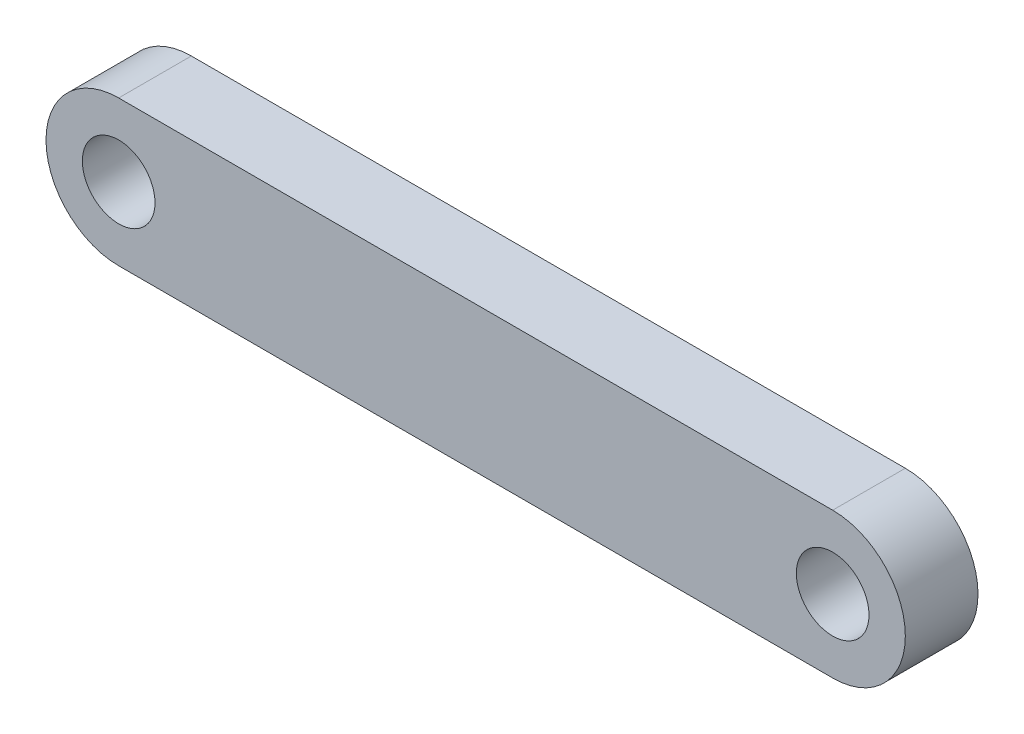
ISO-10303-21;
HEADER;
FILE_DESCRIPTION(('STEP AP214'),'2;1');
FILE_NAME('part.step','',(''),(''),'','','');
FILE_SCHEMA(('AUTOMOTIVE_DESIGN { 1 0 10303 214 1 1 1 1 }'));
ENDSEC;
DATA;
#1=APPLICATION_CONTEXT('core data for automotive mechanical design processes');
#2=APPLICATION_PROTOCOL_DEFINITION('international standard','automotive_design',2000,#1);
#3=PRODUCT_CONTEXT('',#1,'mechanical');
#4=PRODUCT('Part','Part','',(#3));
#5=PRODUCT_RELATED_PRODUCT_CATEGORY('part','',(#4));
#6=PRODUCT_DEFINITION_FORMATION('','',#4);
#7=PRODUCT_DEFINITION_CONTEXT('part definition',#1,'design');
#8=PRODUCT_DEFINITION('design','',#6,#7);
#9=PRODUCT_DEFINITION_SHAPE('','',#8);
#10=(LENGTH_UNIT() NAMED_UNIT(*) SI_UNIT(.MILLI.,.METRE.));
#11=(NAMED_UNIT(*) PLANE_ANGLE_UNIT() SI_UNIT($,.RADIAN.));
#12=(NAMED_UNIT(*) SI_UNIT($,.STERADIAN.) SOLID_ANGLE_UNIT());
#13=UNCERTAINTY_MEASURE_WITH_UNIT(LENGTH_MEASURE(1.E-05),#10,'distance_accuracy_value','');
#14=(GEOMETRIC_REPRESENTATION_CONTEXT(3) GLOBAL_UNCERTAINTY_ASSIGNED_CONTEXT((#13)) GLOBAL_UNIT_ASSIGNED_CONTEXT((#10,
#11,#12)) REPRESENTATION_CONTEXT('',''));
#15=CARTESIAN_POINT('',(0.,0.,0.));
#16=DIRECTION('',(0.,0.,1.));
#17=DIRECTION('',(1.,0.,0.));
#18=AXIS2_PLACEMENT_3D('',#15,#16,#17);
#19=CARTESIAN_POINT('',(0.,0.,2.));
#20=DIRECTION('',(0.,0.,1.));
#21=DIRECTION('',(1.,0.,0.));
#22=AXIS2_PLACEMENT_3D('',#19,#20,#21);
#23=PLANE('',#22);
#24=CARTESIAN_POINT('',(0.,0.,2.));
#25=DIRECTION('',(0.,0.,1.));
#26=DIRECTION('',(1.,0.,0.));
#27=AXIS2_PLACEMENT_3D('',#24,#25,#26);
#28=CIRCLE('',#27,1.);
#29=CARTESIAN_POINT('',(1.,0.,2.));
#30=VERTEX_POINT('',#29);
#31=EDGE_CURVE('E112',#30,#30,#28,.T.);
#32=ORIENTED_EDGE('',*,*,#31,.F.);
#33=EDGE_LOOP('',(#32));
#34=FACE_BOUND('',#33,.T.);
#35=CARTESIAN_POINT('',(0.,0.,2.));
#36=DIRECTION('',(0.,0.,1.));
#37=DIRECTION('',(1.,0.,0.));
#38=AXIS2_PLACEMENT_3D('',#35,#36,#37);
#39=CIRCLE('',#38,2.);
#40=CARTESIAN_POINT('',(0.,2.,2.));
#41=VERTEX_POINT('',#40);
#42=CARTESIAN_POINT('',(0.,-2.,2.));
#43=VERTEX_POINT('',#42);
#44=EDGE_CURVE('E92',#41,#43,#39,.T.);
#45=ORIENTED_EDGE('',*,*,#44,.T.);
#46=DIRECTION('',(1.,0.,0.));
#47=VECTOR('',#46,1.);
#48=CARTESIAN_POINT('',(0.,-2.,2.));
#49=LINE('',#48,#47);
#50=CARTESIAN_POINT('',(19.65,-2.,2.));
#51=VERTEX_POINT('',#50);
#52=EDGE_CURVE('E87',#43,#51,#49,.T.);
#53=ORIENTED_EDGE('',*,*,#52,.T.);
#54=CARTESIAN_POINT('',(19.65,0.,2.));
#55=DIRECTION('',(0.,0.,1.));
#56=DIRECTION('',(1.,0.,0.));
#57=AXIS2_PLACEMENT_3D('',#54,#55,#56);
#58=CIRCLE('',#57,2.);
#59=CARTESIAN_POINT('',(19.65,2.,2.));
#60=VERTEX_POINT('',#59);
#61=EDGE_CURVE('E90',#51,#60,#58,.T.);
#62=ORIENTED_EDGE('',*,*,#61,.T.);
#63=DIRECTION('',(-1.,0.,0.));
#64=VECTOR('',#63,1.);
#65=CARTESIAN_POINT('',(0.,2.,2.));
#66=LINE('',#65,#64);
#67=EDGE_CURVE('E57',#60,#41,#66,.T.);
#68=ORIENTED_EDGE('',*,*,#67,.T.);
#69=EDGE_LOOP('',(#45,#53,#62,#68));
#70=FACE_BOUND('',#69,.T.);
#71=CARTESIAN_POINT('',(19.65,0.,2.));
#72=DIRECTION('',(0.,0.,1.));
#73=DIRECTION('',(1.,0.,0.));
#74=AXIS2_PLACEMENT_3D('',#71,#72,#73);
#75=CIRCLE('',#74,1.);
#76=CARTESIAN_POINT('',(20.65,0.,2.));
#77=VERTEX_POINT('',#76);
#78=EDGE_CURVE('E134',#77,#77,#75,.T.);
#79=ORIENTED_EDGE('',*,*,#78,.F.);
#80=EDGE_LOOP('',(#79));
#81=FACE_BOUND('',#80,.T.);
#82=ADVANCED_FACE('F39',(#34,#70,#81),#23,.T.);
#83=CARTESIAN_POINT('',(0.,0.,0.));
#84=DIRECTION('',(0.,0.,1.));
#85=DIRECTION('',(1.,0.,0.));
#86=AXIS2_PLACEMENT_3D('',#83,#84,#85);
#87=PLANE('',#86);
#88=CARTESIAN_POINT('',(0.,0.,0.));
#89=DIRECTION('',(0.,0.,1.));
#90=DIRECTION('',(1.,0.,0.));
#91=AXIS2_PLACEMENT_3D('',#88,#89,#90);
#92=CIRCLE('',#91,2.);
#93=CARTESIAN_POINT('',(0.,2.,0.));
#94=VERTEX_POINT('',#93);
#95=CARTESIAN_POINT('',(0.,-2.,0.));
#96=VERTEX_POINT('',#95);
#97=EDGE_CURVE('E108',#94,#96,#92,.T.);
#98=ORIENTED_EDGE('',*,*,#97,.F.);
#99=DIRECTION('',(-1.,0.,0.));
#100=VECTOR('',#99,1.);
#101=CARTESIAN_POINT('',(0.,2.,0.));
#102=LINE('',#101,#100);
#103=CARTESIAN_POINT('',(19.65,2.,0.));
#104=VERTEX_POINT('',#103);
#105=EDGE_CURVE('E80',#104,#94,#102,.T.);
#106=ORIENTED_EDGE('',*,*,#105,.F.);
#107=CARTESIAN_POINT('',(19.65,0.,0.));
#108=DIRECTION('',(0.,0.,1.));
#109=DIRECTION('',(1.,0.,0.));
#110=AXIS2_PLACEMENT_3D('',#107,#108,#109);
#111=CIRCLE('',#110,2.);
#112=CARTESIAN_POINT('',(19.65,-2.,0.));
#113=VERTEX_POINT('',#112);
#114=EDGE_CURVE('E74',#113,#104,#111,.T.);
#115=ORIENTED_EDGE('',*,*,#114,.F.);
#116=DIRECTION('',(1.,0.,0.));
#117=VECTOR('',#116,1.);
#118=CARTESIAN_POINT('',(0.,-2.,0.));
#119=LINE('',#118,#117);
#120=EDGE_CURVE('E97',#96,#113,#119,.T.);
#121=ORIENTED_EDGE('',*,*,#120,.F.);
#122=EDGE_LOOP('',(#98,#106,#115,#121));
#123=FACE_BOUND('',#122,.T.);
#124=CARTESIAN_POINT('',(0.,0.,0.));
#125=DIRECTION('',(0.,0.,1.));
#126=DIRECTION('',(1.,0.,0.));
#127=AXIS2_PLACEMENT_3D('',#124,#125,#126);
#128=CIRCLE('',#127,1.);
#129=CARTESIAN_POINT('',(1.,0.,0.));
#130=VERTEX_POINT('',#129);
#131=EDGE_CURVE('E130',#130,#130,#128,.T.);
#132=ORIENTED_EDGE('',*,*,#131,.T.);
#133=EDGE_LOOP('',(#132));
#134=FACE_BOUND('',#133,.T.);
#135=CARTESIAN_POINT('',(19.65,0.,0.));
#136=DIRECTION('',(0.,0.,1.));
#137=DIRECTION('',(1.,0.,0.));
#138=AXIS2_PLACEMENT_3D('',#135,#136,#137);
#139=CIRCLE('',#138,1.);
#140=CARTESIAN_POINT('',(20.65,0.,0.));
#141=VERTEX_POINT('',#140);
#142=EDGE_CURVE('E138',#141,#141,#139,.T.);
#143=ORIENTED_EDGE('',*,*,#142,.T.);
#144=EDGE_LOOP('',(#143));
#145=FACE_BOUND('',#144,.T.);
#146=ADVANCED_FACE('F125',(#123,#134,#145),#87,.F.);
#147=CARTESIAN_POINT('',(0.,0.,2.));
#148=DIRECTION('',(0.,0.,-1.));
#149=DIRECTION('',(-1.,0.,0.));
#150=AXIS2_PLACEMENT_3D('',#147,#148,#149);
#151=CYLINDRICAL_SURFACE('',#150,2.);
#152=ORIENTED_EDGE('',*,*,#97,.T.);
#153=DIRECTION('',(0.,0.,-1.));
#154=VECTOR('',#153,1.);
#155=CARTESIAN_POINT('',(0.,-2.,2.));
#156=LINE('',#155,#154);
#157=EDGE_CURVE('E11',#43,#96,#156,.T.);
#158=ORIENTED_EDGE('',*,*,#157,.F.);
#159=ORIENTED_EDGE('',*,*,#44,.F.);
#160=DIRECTION('',(0.,0.,-1.));
#161=VECTOR('',#160,1.);
#162=CARTESIAN_POINT('',(0.,2.,2.));
#163=LINE('',#162,#161);
#164=EDGE_CURVE('E104',#41,#94,#163,.T.);
#165=ORIENTED_EDGE('',*,*,#164,.T.);
#166=EDGE_LOOP('',(#152,#158,#159,#165));
#167=FACE_BOUND('',#166,.T.);
#168=ADVANCED_FACE('F41',(#167),#151,.T.);
#169=CARTESIAN_POINT('',(0.,-2.,2.));
#170=DIRECTION('',(0.,1.,0.));
#171=DIRECTION('',(0.,0.,1.));
#172=AXIS2_PLACEMENT_3D('',#169,#170,#171);
#173=PLANE('',#172);
#174=ORIENTED_EDGE('',*,*,#120,.T.);
#175=DIRECTION('',(0.,0.,-1.));
#176=VECTOR('',#175,1.);
#177=CARTESIAN_POINT('',(19.65,-2.,2.));
#178=LINE('',#177,#176);
#179=EDGE_CURVE('E49',#51,#113,#178,.T.);
#180=ORIENTED_EDGE('',*,*,#179,.F.);
#181=ORIENTED_EDGE('',*,*,#52,.F.);
#182=ORIENTED_EDGE('',*,*,#157,.T.);
#183=EDGE_LOOP('',(#174,#180,#181,#182));
#184=FACE_BOUND('',#183,.T.);
#185=ADVANCED_FACE('F96',(#184),#173,.F.);
#186=CARTESIAN_POINT('',(19.65,0.,2.));
#187=DIRECTION('',(0.,0.,-1.));
#188=DIRECTION('',(-1.,0.,0.));
#189=AXIS2_PLACEMENT_3D('',#186,#187,#188);
#190=CYLINDRICAL_SURFACE('',#189,2.);
#191=ORIENTED_EDGE('',*,*,#114,.T.);
#192=DIRECTION('',(0.,0.,-1.));
#193=VECTOR('',#192,1.);
#194=CARTESIAN_POINT('',(19.65,2.,2.));
#195=LINE('',#194,#193);
#196=EDGE_CURVE('E99',#60,#104,#195,.T.);
#197=ORIENTED_EDGE('',*,*,#196,.F.);
#198=ORIENTED_EDGE('',*,*,#61,.F.);
#199=ORIENTED_EDGE('',*,*,#179,.T.);
#200=EDGE_LOOP('',(#191,#197,#198,#199));
#201=FACE_BOUND('',#200,.T.);
#202=ADVANCED_FACE('F100',(#201),#190,.T.);
#203=CARTESIAN_POINT('',(0.,2.,2.));
#204=DIRECTION('',(0.,-1.,0.));
#205=DIRECTION('',(0.,0.,-1.));
#206=AXIS2_PLACEMENT_3D('',#203,#204,#205);
#207=PLANE('',#206);
#208=ORIENTED_EDGE('',*,*,#105,.T.);
#209=ORIENTED_EDGE('',*,*,#164,.F.);
#210=ORIENTED_EDGE('',*,*,#67,.F.);
#211=ORIENTED_EDGE('',*,*,#196,.T.);
#212=EDGE_LOOP('',(#208,#209,#210,#211));
#213=FACE_BOUND('',#212,.T.);
#214=ADVANCED_FACE('F122',(#213),#207,.F.);
#215=CARTESIAN_POINT('',(0.,0.,2.));
#216=DIRECTION('',(0.,0.,-1.));
#217=DIRECTION('',(-1.,0.,0.));
#218=AXIS2_PLACEMENT_3D('',#215,#216,#217);
#219=CYLINDRICAL_SURFACE('',#218,1.);
#220=ORIENTED_EDGE('',*,*,#31,.T.);
#221=EDGE_LOOP('',(#220));
#222=FACE_BOUND('',#221,.T.);
#223=ORIENTED_EDGE('',*,*,#131,.F.);
#224=EDGE_LOOP('',(#223));
#225=FACE_BOUND('',#224,.T.);
#226=ADVANCED_FACE('F157',(#222,#225),#219,.F.);
#227=CARTESIAN_POINT('',(19.65,0.,2.));
#228=DIRECTION('',(0.,0.,-1.));
#229=DIRECTION('',(-1.,0.,0.));
#230=AXIS2_PLACEMENT_3D('',#227,#228,#229);
#231=CYLINDRICAL_SURFACE('',#230,1.);
#232=ORIENTED_EDGE('',*,*,#78,.T.);
#233=EDGE_LOOP('',(#232));
#234=FACE_BOUND('',#233,.T.);
#235=ORIENTED_EDGE('',*,*,#142,.F.);
#236=EDGE_LOOP('',(#235));
#237=FACE_BOUND('',#236,.T.);
#238=ADVANCED_FACE('F146',(#234,#237),#231,.F.);
#239=CLOSED_SHELL('',(#82,#146,#168,#185,#202,#214,#226,#238));
#240=MANIFOLD_SOLID_BREP('B2',#239);
#241=ADVANCED_BREP_SHAPE_REPRESENTATION('',(#18,#240),#14);
#242=SHAPE_DEFINITION_REPRESENTATION(#9,#241);
ENDSEC;
END-ISO-10303-21;
